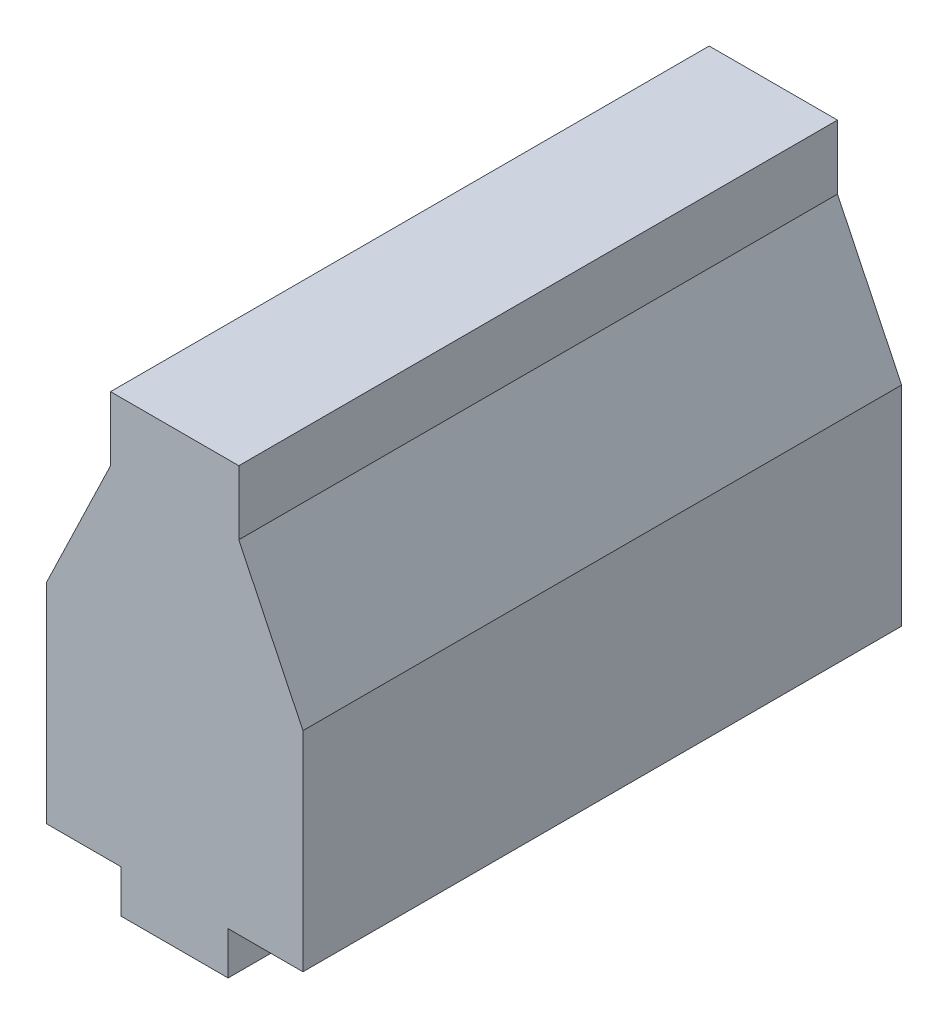
ISO-10303-21;
HEADER;
FILE_DESCRIPTION(('STEP AP214'),'2;1');
FILE_NAME('part.step','',(''),(''),'','','');
FILE_SCHEMA(('AUTOMOTIVE_DESIGN { 1 0 10303 214 1 1 1 1 }'));
ENDSEC;
DATA;
#1=APPLICATION_CONTEXT('core data for automotive mechanical design processes');
#2=APPLICATION_PROTOCOL_DEFINITION('international standard','automotive_design',2000,#1);
#3=PRODUCT_CONTEXT('',#1,'mechanical');
#4=PRODUCT('Part','Part','',(#3));
#5=PRODUCT_RELATED_PRODUCT_CATEGORY('part','',(#4));
#6=PRODUCT_DEFINITION_FORMATION('','',#4);
#7=PRODUCT_DEFINITION_CONTEXT('part definition',#1,'design');
#8=PRODUCT_DEFINITION('design','',#6,#7);
#9=PRODUCT_DEFINITION_SHAPE('','',#8);
#10=(LENGTH_UNIT() NAMED_UNIT(*) SI_UNIT(.MILLI.,.METRE.));
#11=(NAMED_UNIT(*) PLANE_ANGLE_UNIT() SI_UNIT($,.RADIAN.));
#12=(NAMED_UNIT(*) SI_UNIT($,.STERADIAN.) SOLID_ANGLE_UNIT());
#13=UNCERTAINTY_MEASURE_WITH_UNIT(LENGTH_MEASURE(1.E-05),#10,'distance_accuracy_value','');
#14=(GEOMETRIC_REPRESENTATION_CONTEXT(3) GLOBAL_UNCERTAINTY_ASSIGNED_CONTEXT((#13)) GLOBAL_UNIT_ASSIGNED_CONTEXT((#10,
#11,#12)) REPRESENTATION_CONTEXT('',''));
#15=CARTESIAN_POINT('',(0.,0.,0.));
#16=DIRECTION('',(0.,0.,1.));
#17=DIRECTION('',(1.,0.,0.));
#18=AXIS2_PLACEMENT_3D('',#15,#16,#17);
#19=CARTESIAN_POINT('',(-3.,5.2695652173913,28.));
#20=DIRECTION('',(1.,0.,0.));
#21=DIRECTION('',(0.,0.,-1.));
#22=AXIS2_PLACEMENT_3D('',#19,#20,#21);
#23=PLANE('',#22);
#24=DIRECTION('',(0.,-1.,0.));
#25=VECTOR('',#24,1.);
#26=CARTESIAN_POINT('',(-3.,5.2695652173913,0.));
#27=LINE('',#26,#25);
#28=CARTESIAN_POINT('',(-3.,8.2695652173913,0.));
#29=VERTEX_POINT('',#28);
#30=CARTESIAN_POINT('',(-3.,5.2695652173913,0.));
#31=VERTEX_POINT('',#30);
#32=EDGE_CURVE('E154',#29,#31,#27,.T.);
#33=ORIENTED_EDGE('',*,*,#32,.T.);
#34=DIRECTION('',(0.,0.,-1.));
#35=VECTOR('',#34,1.);
#36=CARTESIAN_POINT('',(-3.,5.2695652173913,28.));
#37=LINE('',#36,#35);
#38=CARTESIAN_POINT('',(-3.,5.2695652173913,28.));
#39=VERTEX_POINT('',#38);
#40=EDGE_CURVE('E11',#39,#31,#37,.T.);
#41=ORIENTED_EDGE('',*,*,#40,.F.);
#42=DIRECTION('',(0.,-1.,0.));
#43=VECTOR('',#42,1.);
#44=CARTESIAN_POINT('',(-3.,5.2695652173913,28.));
#45=LINE('',#44,#43);
#46=CARTESIAN_POINT('',(-3.,8.2695652173913,28.));
#47=VERTEX_POINT('',#46);
#48=EDGE_CURVE('E176',#47,#39,#45,.T.);
#49=ORIENTED_EDGE('',*,*,#48,.F.);
#50=DIRECTION('',(0.,0.,-1.));
#51=VECTOR('',#50,1.);
#52=CARTESIAN_POINT('',(-3.,8.2695652173913,28.));
#53=LINE('',#52,#51);
#54=EDGE_CURVE('E150',#47,#29,#53,.T.);
#55=ORIENTED_EDGE('',*,*,#54,.T.);
#56=EDGE_LOOP('',(#33,#41,#49,#55));
#57=FACE_BOUND('',#56,.T.);
#58=ADVANCED_FACE('F34',(#57),#23,.F.);
#59=CARTESIAN_POINT('',(-3.,5.2695652173913,28.));
#60=DIRECTION('',(0.901110804696941,-0.433588880921122,0.));
#61=DIRECTION('',(0.433588880921123,0.901110804696941,0.));
#62=AXIS2_PLACEMENT_3D('',#59,#60,#61);
#63=PLANE('',#62);
#64=DIRECTION('',(-0.433588880921123,-0.901110804696941,0.));
#65=VECTOR('',#64,1.);
#66=CARTESIAN_POINT('',(-3.,5.2695652173913,0.));
#67=LINE('',#66,#65);
#68=CARTESIAN_POINT('',(-6.,-0.965217391304347,0.));
#69=VERTEX_POINT('',#68);
#70=EDGE_CURVE('E157',#31,#69,#67,.T.);
#71=ORIENTED_EDGE('',*,*,#70,.T.);
#72=DIRECTION('',(0.,0.,-1.));
#73=VECTOR('',#72,1.);
#74=CARTESIAN_POINT('',(-6.,-0.965217391304347,28.));
#75=LINE('',#74,#73);
#76=CARTESIAN_POINT('',(-6.,-0.965217391304347,28.));
#77=VERTEX_POINT('',#76);
#78=EDGE_CURVE('E42',#77,#69,#75,.T.);
#79=ORIENTED_EDGE('',*,*,#78,.F.);
#80=DIRECTION('',(-0.433588880921123,-0.901110804696941,0.));
#81=VECTOR('',#80,1.);
#82=CARTESIAN_POINT('',(-3.,5.2695652173913,28.));
#83=LINE('',#82,#81);
#84=EDGE_CURVE('E105',#39,#77,#83,.T.);
#85=ORIENTED_EDGE('',*,*,#84,.F.);
#86=ORIENTED_EDGE('',*,*,#40,.T.);
#87=EDGE_LOOP('',(#71,#79,#85,#86));
#88=FACE_BOUND('',#87,.T.);
#89=ADVANCED_FACE('F254',(#88),#63,.F.);
#90=CARTESIAN_POINT('',(-6.,-0.965217391304347,28.));
#91=DIRECTION('',(1.,0.,0.));
#92=DIRECTION('',(0.,1.,0.));
#93=AXIS2_PLACEMENT_3D('',#90,#91,#92);
#94=PLANE('',#93);
#95=DIRECTION('',(0.,-1.,0.));
#96=VECTOR('',#95,1.);
#97=CARTESIAN_POINT('',(-6.,-0.965217391304347,0.));
#98=LINE('',#97,#96);
#99=CARTESIAN_POINT('',(-6.,-10.7304347826087,0.));
#100=VERTEX_POINT('',#99);
#101=EDGE_CURVE('E159',#69,#100,#98,.T.);
#102=ORIENTED_EDGE('',*,*,#101,.T.);
#103=DIRECTION('',(0.,0.,-1.));
#104=VECTOR('',#103,1.);
#105=CARTESIAN_POINT('',(-6.,-10.7304347826087,28.));
#106=LINE('',#105,#104);
#107=CARTESIAN_POINT('',(-6.,-10.7304347826087,28.));
#108=VERTEX_POINT('',#107);
#109=EDGE_CURVE('E195',#108,#100,#106,.T.);
#110=ORIENTED_EDGE('',*,*,#109,.F.);
#111=DIRECTION('',(0.,-1.,0.));
#112=VECTOR('',#111,1.);
#113=CARTESIAN_POINT('',(-6.,-0.965217391304347,28.));
#114=LINE('',#113,#112);
#115=EDGE_CURVE('E203',#77,#108,#114,.T.);
#116=ORIENTED_EDGE('',*,*,#115,.F.);
#117=ORIENTED_EDGE('',*,*,#78,.T.);
#118=EDGE_LOOP('',(#102,#110,#116,#117));
#119=FACE_BOUND('',#118,.T.);
#120=ADVANCED_FACE('F201',(#119),#94,.F.);
#121=CARTESIAN_POINT('',(-6.,-10.7304347826087,28.));
#122=DIRECTION('',(0.,1.,0.));
#123=DIRECTION('',(0.,0.,1.));
#124=AXIS2_PLACEMENT_3D('',#121,#122,#123);
#125=PLANE('',#124);
#126=DIRECTION('',(1.,0.,0.));
#127=VECTOR('',#126,1.);
#128=CARTESIAN_POINT('',(-6.,-10.7304347826087,0.));
#129=LINE('',#128,#127);
#130=CARTESIAN_POINT('',(-2.5,-10.7304347826087,0.));
#131=VERTEX_POINT('',#130);
#132=EDGE_CURVE('E161',#100,#131,#129,.T.);
#133=ORIENTED_EDGE('',*,*,#132,.T.);
#134=DIRECTION('',(0.,0.,-1.));
#135=VECTOR('',#134,1.);
#136=CARTESIAN_POINT('',(-2.5,-10.7304347826087,28.));
#137=LINE('',#136,#135);
#138=CARTESIAN_POINT('',(-2.5,-10.7304347826087,28.));
#139=VERTEX_POINT('',#138);
#140=EDGE_CURVE('E192',#139,#131,#137,.T.);
#141=ORIENTED_EDGE('',*,*,#140,.F.);
#142=DIRECTION('',(1.,0.,0.));
#143=VECTOR('',#142,1.);
#144=CARTESIAN_POINT('',(-6.,-10.7304347826087,28.));
#145=LINE('',#144,#143);
#146=EDGE_CURVE('E221',#108,#139,#145,.T.);
#147=ORIENTED_EDGE('',*,*,#146,.F.);
#148=ORIENTED_EDGE('',*,*,#109,.T.);
#149=EDGE_LOOP('',(#133,#141,#147,#148));
#150=FACE_BOUND('',#149,.T.);
#151=ADVANCED_FACE('F212',(#150),#125,.F.);
#152=CARTESIAN_POINT('',(-2.5,-10.7304347826087,28.));
#153=DIRECTION('',(1.,0.,0.));
#154=DIRECTION('',(0.,1.,0.));
#155=AXIS2_PLACEMENT_3D('',#152,#153,#154);
#156=PLANE('',#155);
#157=DIRECTION('',(0.,-1.,0.));
#158=VECTOR('',#157,1.);
#159=CARTESIAN_POINT('',(-2.5,-10.7304347826087,0.));
#160=LINE('',#159,#158);
#161=CARTESIAN_POINT('',(-2.5,-12.7304347826087,0.));
#162=VERTEX_POINT('',#161);
#163=EDGE_CURVE('E163',#131,#162,#160,.T.);
#164=ORIENTED_EDGE('',*,*,#163,.T.);
#165=DIRECTION('',(0.,0.,-1.));
#166=VECTOR('',#165,1.);
#167=CARTESIAN_POINT('',(-2.5,-12.7304347826087,28.));
#168=LINE('',#167,#166);
#169=CARTESIAN_POINT('',(-2.5,-12.7304347826087,28.));
#170=VERTEX_POINT('',#169);
#171=EDGE_CURVE('E189',#170,#162,#168,.T.);
#172=ORIENTED_EDGE('',*,*,#171,.F.);
#173=DIRECTION('',(0.,-1.,0.));
#174=VECTOR('',#173,1.);
#175=CARTESIAN_POINT('',(-2.5,-10.7304347826087,28.));
#176=LINE('',#175,#174);
#177=EDGE_CURVE('E218',#139,#170,#176,.T.);
#178=ORIENTED_EDGE('',*,*,#177,.F.);
#179=ORIENTED_EDGE('',*,*,#140,.T.);
#180=EDGE_LOOP('',(#164,#172,#178,#179));
#181=FACE_BOUND('',#180,.T.);
#182=ADVANCED_FACE('F216',(#181),#156,.F.);
#183=CARTESIAN_POINT('',(-2.5,-12.7304347826087,28.));
#184=DIRECTION('',(0.,1.,0.));
#185=DIRECTION('',(0.,0.,1.));
#186=AXIS2_PLACEMENT_3D('',#183,#184,#185);
#187=PLANE('',#186);
#188=DIRECTION('',(1.,0.,0.));
#189=VECTOR('',#188,1.);
#190=CARTESIAN_POINT('',(-2.5,-12.7304347826087,0.));
#191=LINE('',#190,#189);
#192=CARTESIAN_POINT('',(2.5,-12.7304347826087,0.));
#193=VERTEX_POINT('',#192);
#194=EDGE_CURVE('E165',#162,#193,#191,.T.);
#195=ORIENTED_EDGE('',*,*,#194,.T.);
#196=DIRECTION('',(0.,0.,-1.));
#197=VECTOR('',#196,1.);
#198=CARTESIAN_POINT('',(2.5,-12.7304347826087,28.));
#199=LINE('',#198,#197);
#200=CARTESIAN_POINT('',(2.5,-12.7304347826087,28.));
#201=VERTEX_POINT('',#200);
#202=EDGE_CURVE('E186',#201,#193,#199,.T.);
#203=ORIENTED_EDGE('',*,*,#202,.F.);
#204=DIRECTION('',(1.,0.,0.));
#205=VECTOR('',#204,1.);
#206=CARTESIAN_POINT('',(-2.5,-12.7304347826087,28.));
#207=LINE('',#206,#205);
#208=EDGE_CURVE('E220',#170,#201,#207,.T.);
#209=ORIENTED_EDGE('',*,*,#208,.F.);
#210=ORIENTED_EDGE('',*,*,#171,.T.);
#211=EDGE_LOOP('',(#195,#203,#209,#210));
#212=FACE_BOUND('',#211,.T.);
#213=ADVANCED_FACE('F267',(#212),#187,.F.);
#214=CARTESIAN_POINT('',(2.5,-12.7304347826087,28.));
#215=DIRECTION('',(-1.,0.,0.));
#216=DIRECTION('',(0.,-1.,0.));
#217=AXIS2_PLACEMENT_3D('',#214,#215,#216);
#218=PLANE('',#217);
#219=DIRECTION('',(0.,1.,0.));
#220=VECTOR('',#219,1.);
#221=CARTESIAN_POINT('',(2.5,-12.7304347826087,0.));
#222=LINE('',#221,#220);
#223=CARTESIAN_POINT('',(2.5,-10.7304347826087,0.));
#224=VERTEX_POINT('',#223);
#225=EDGE_CURVE('E167',#193,#224,#222,.T.);
#226=ORIENTED_EDGE('',*,*,#225,.T.);
#227=DIRECTION('',(0.,0.,-1.));
#228=VECTOR('',#227,1.);
#229=CARTESIAN_POINT('',(2.5,-10.7304347826087,28.));
#230=LINE('',#229,#228);
#231=CARTESIAN_POINT('',(2.5,-10.7304347826087,28.));
#232=VERTEX_POINT('',#231);
#233=EDGE_CURVE('E183',#232,#224,#230,.T.);
#234=ORIENTED_EDGE('',*,*,#233,.F.);
#235=DIRECTION('',(0.,1.,0.));
#236=VECTOR('',#235,1.);
#237=CARTESIAN_POINT('',(2.5,-12.7304347826087,28.));
#238=LINE('',#237,#236);
#239=EDGE_CURVE('E223',#201,#232,#238,.T.);
#240=ORIENTED_EDGE('',*,*,#239,.F.);
#241=ORIENTED_EDGE('',*,*,#202,.T.);
#242=EDGE_LOOP('',(#226,#234,#240,#241));
#243=FACE_BOUND('',#242,.T.);
#244=ADVANCED_FACE('F270',(#243),#218,.F.);
#245=CARTESIAN_POINT('',(2.5,-10.7304347826087,28.));
#246=DIRECTION('',(0.,1.,0.));
#247=DIRECTION('',(0.,0.,1.));
#248=AXIS2_PLACEMENT_3D('',#245,#246,#247);
#249=PLANE('',#248);
#250=DIRECTION('',(1.,0.,0.));
#251=VECTOR('',#250,1.);
#252=CARTESIAN_POINT('',(2.5,-10.7304347826087,0.));
#253=LINE('',#252,#251);
#254=CARTESIAN_POINT('',(6.,-10.7304347826087,0.));
#255=VERTEX_POINT('',#254);
#256=EDGE_CURVE('E169',#224,#255,#253,.T.);
#257=ORIENTED_EDGE('',*,*,#256,.T.);
#258=DIRECTION('',(0.,0.,-1.));
#259=VECTOR('',#258,1.);
#260=CARTESIAN_POINT('',(6.,-10.7304347826087,28.));
#261=LINE('',#260,#259);
#262=CARTESIAN_POINT('',(6.,-10.7304347826087,28.));
#263=VERTEX_POINT('',#262);
#264=EDGE_CURVE('E180',#263,#255,#261,.T.);
#265=ORIENTED_EDGE('',*,*,#264,.F.);
#266=DIRECTION('',(1.,0.,0.));
#267=VECTOR('',#266,1.);
#268=CARTESIAN_POINT('',(2.5,-10.7304347826087,28.));
#269=LINE('',#268,#267);
#270=EDGE_CURVE('E229',#232,#263,#269,.T.);
#271=ORIENTED_EDGE('',*,*,#270,.F.);
#272=ORIENTED_EDGE('',*,*,#233,.T.);
#273=EDGE_LOOP('',(#257,#265,#271,#272));
#274=FACE_BOUND('',#273,.T.);
#275=ADVANCED_FACE('F235',(#274),#249,.F.);
#276=CARTESIAN_POINT('',(6.,-10.7304347826087,28.));
#277=DIRECTION('',(-1.,0.,0.));
#278=DIRECTION('',(0.,0.,1.));
#279=AXIS2_PLACEMENT_3D('',#276,#277,#278);
#280=PLANE('',#279);
#281=DIRECTION('',(0.,1.,0.));
#282=VECTOR('',#281,1.);
#283=CARTESIAN_POINT('',(6.,-10.7304347826087,0.));
#284=LINE('',#283,#282);
#285=CARTESIAN_POINT('',(6.,-0.960434782608701,0.));
#286=VERTEX_POINT('',#285);
#287=EDGE_CURVE('E171',#255,#286,#284,.T.);
#288=ORIENTED_EDGE('',*,*,#287,.T.);
#289=DIRECTION('',(0.,0.,-1.));
#290=VECTOR('',#289,1.);
#291=CARTESIAN_POINT('',(6.,-0.960434782608701,28.));
#292=LINE('',#291,#290);
#293=CARTESIAN_POINT('',(6.,-0.960434782608701,28.));
#294=VERTEX_POINT('',#293);
#295=EDGE_CURVE('E145',#294,#286,#292,.T.);
#296=ORIENTED_EDGE('',*,*,#295,.F.);
#297=DIRECTION('',(0.,1.,0.));
#298=VECTOR('',#297,1.);
#299=CARTESIAN_POINT('',(6.,-10.7304347826087,28.));
#300=LINE('',#299,#298);
#301=EDGE_CURVE('E136',#263,#294,#300,.T.);
#302=ORIENTED_EDGE('',*,*,#301,.F.);
#303=ORIENTED_EDGE('',*,*,#264,.T.);
#304=EDGE_LOOP('',(#288,#296,#302,#303));
#305=FACE_BOUND('',#304,.T.);
#306=ADVANCED_FACE('F239',(#305),#280,.F.);
#307=CARTESIAN_POINT('',(6.,-0.960434782608701,28.));
#308=DIRECTION('',(-0.900980732673074,-0.433859100805654,0.));
#309=DIRECTION('',(0.433859100805654,-0.900980732673074,0.));
#310=AXIS2_PLACEMENT_3D('',#307,#308,#309);
#311=PLANE('',#310);
#312=DIRECTION('',(-0.433859100805654,0.900980732673074,0.));
#313=VECTOR('',#312,1.);
#314=CARTESIAN_POINT('',(6.,-0.960434782608701,0.));
#315=LINE('',#314,#313);
#316=CARTESIAN_POINT('',(3.,5.2695652173913,0.));
#317=VERTEX_POINT('',#316);
#318=EDGE_CURVE('E144',#286,#317,#315,.T.);
#319=ORIENTED_EDGE('',*,*,#318,.T.);
#320=DIRECTION('',(0.,0.,-1.));
#321=VECTOR('',#320,1.);
#322=CARTESIAN_POINT('',(3.,5.2695652173913,28.));
#323=LINE('',#322,#321);
#324=CARTESIAN_POINT('',(3.,5.2695652173913,28.));
#325=VERTEX_POINT('',#324);
#326=EDGE_CURVE('E141',#325,#317,#323,.T.);
#327=ORIENTED_EDGE('',*,*,#326,.F.);
#328=DIRECTION('',(-0.433859100805654,0.900980732673074,0.));
#329=VECTOR('',#328,1.);
#330=CARTESIAN_POINT('',(6.,-0.960434782608701,28.));
#331=LINE('',#330,#329);
#332=EDGE_CURVE('E130',#294,#325,#331,.T.);
#333=ORIENTED_EDGE('',*,*,#332,.F.);
#334=ORIENTED_EDGE('',*,*,#295,.T.);
#335=EDGE_LOOP('',(#319,#327,#333,#334));
#336=FACE_BOUND('',#335,.T.);
#337=ADVANCED_FACE('F142',(#336),#311,.F.);
#338=CARTESIAN_POINT('',(3.,8.2695652173913,28.));
#339=DIRECTION('',(-1.,0.,0.));
#340=DIRECTION('',(0.,-1.,0.));
#341=AXIS2_PLACEMENT_3D('',#338,#339,#340);
#342=PLANE('',#341);
#343=DIRECTION('',(0.,1.,0.));
#344=VECTOR('',#343,1.);
#345=CARTESIAN_POINT('',(3.,8.2695652173913,0.));
#346=LINE('',#345,#344);
#347=CARTESIAN_POINT('',(3.,8.2695652173913,0.));
#348=VERTEX_POINT('',#347);
#349=EDGE_CURVE('E91',#317,#348,#346,.T.);
#350=ORIENTED_EDGE('',*,*,#349,.T.);
#351=DIRECTION('',(0.,0.,-1.));
#352=VECTOR('',#351,1.);
#353=CARTESIAN_POINT('',(3.,8.2695652173913,28.));
#354=LINE('',#353,#352);
#355=CARTESIAN_POINT('',(3.,8.2695652173913,28.));
#356=VERTEX_POINT('',#355);
#357=EDGE_CURVE('E146',#356,#348,#354,.T.);
#358=ORIENTED_EDGE('',*,*,#357,.F.);
#359=DIRECTION('',(0.,1.,0.));
#360=VECTOR('',#359,1.);
#361=CARTESIAN_POINT('',(3.,8.2695652173913,28.));
#362=LINE('',#361,#360);
#363=EDGE_CURVE('E134',#325,#356,#362,.T.);
#364=ORIENTED_EDGE('',*,*,#363,.F.);
#365=ORIENTED_EDGE('',*,*,#326,.T.);
#366=EDGE_LOOP('',(#350,#358,#364,#365));
#367=FACE_BOUND('',#366,.T.);
#368=ADVANCED_FACE('F148',(#367),#342,.F.);
#369=CARTESIAN_POINT('',(-3.,8.2695652173913,28.));
#370=DIRECTION('',(0.,-1.,0.));
#371=DIRECTION('',(0.,0.,-1.));
#372=AXIS2_PLACEMENT_3D('',#369,#370,#371);
#373=PLANE('',#372);
#374=DIRECTION('',(-1.,0.,0.));
#375=VECTOR('',#374,1.);
#376=CARTESIAN_POINT('',(-3.,8.2695652173913,0.));
#377=LINE('',#376,#375);
#378=EDGE_CURVE('E97',#348,#29,#377,.T.);
#379=ORIENTED_EDGE('',*,*,#378,.T.);
#380=ORIENTED_EDGE('',*,*,#54,.F.);
#381=DIRECTION('',(-1.,0.,0.));
#382=VECTOR('',#381,1.);
#383=CARTESIAN_POINT('',(-3.,8.2695652173913,28.));
#384=LINE('',#383,#382);
#385=EDGE_CURVE('E50',#356,#47,#384,.T.);
#386=ORIENTED_EDGE('',*,*,#385,.F.);
#387=ORIENTED_EDGE('',*,*,#357,.T.);
#388=EDGE_LOOP('',(#379,#380,#386,#387));
#389=FACE_BOUND('',#388,.T.);
#390=ADVANCED_FACE('F243',(#389),#373,.F.);
#391=CARTESIAN_POINT('',(0.,0.,28.));
#392=DIRECTION('',(0.,0.,-1.));
#393=DIRECTION('',(-1.,0.,0.));
#394=AXIS2_PLACEMENT_3D('',#391,#392,#393);
#395=PLANE('',#394);
#396=ORIENTED_EDGE('',*,*,#48,.T.);
#397=ORIENTED_EDGE('',*,*,#84,.T.);
#398=ORIENTED_EDGE('',*,*,#115,.T.);
#399=ORIENTED_EDGE('',*,*,#146,.T.);
#400=ORIENTED_EDGE('',*,*,#177,.T.);
#401=ORIENTED_EDGE('',*,*,#208,.T.);
#402=ORIENTED_EDGE('',*,*,#239,.T.);
#403=ORIENTED_EDGE('',*,*,#270,.T.);
#404=ORIENTED_EDGE('',*,*,#301,.T.);
#405=ORIENTED_EDGE('',*,*,#332,.T.);
#406=ORIENTED_EDGE('',*,*,#363,.T.);
#407=ORIENTED_EDGE('',*,*,#385,.T.);
#408=EDGE_LOOP('',(#396,#397,#398,#399,#400,#401,#402,#403,#404,#405,#406,#407));
#409=FACE_BOUND('',#408,.T.);
#410=ADVANCED_FACE('F132',(#409),#395,.F.);
#411=CARTESIAN_POINT('',(0.,0.,0.));
#412=DIRECTION('',(0.,0.,-1.));
#413=DIRECTION('',(-1.,0.,0.));
#414=AXIS2_PLACEMENT_3D('',#411,#412,#413);
#415=PLANE('',#414);
#416=ORIENTED_EDGE('',*,*,#32,.F.);
#417=ORIENTED_EDGE('',*,*,#378,.F.);
#418=ORIENTED_EDGE('',*,*,#349,.F.);
#419=ORIENTED_EDGE('',*,*,#318,.F.);
#420=ORIENTED_EDGE('',*,*,#287,.F.);
#421=ORIENTED_EDGE('',*,*,#256,.F.);
#422=ORIENTED_EDGE('',*,*,#225,.F.);
#423=ORIENTED_EDGE('',*,*,#194,.F.);
#424=ORIENTED_EDGE('',*,*,#163,.F.);
#425=ORIENTED_EDGE('',*,*,#132,.F.);
#426=ORIENTED_EDGE('',*,*,#101,.F.);
#427=ORIENTED_EDGE('',*,*,#70,.F.);
#428=EDGE_LOOP('',(#416,#417,#418,#419,#420,#421,#422,#423,#424,#425,#426,#427));
#429=FACE_BOUND('',#428,.T.);
#430=ADVANCED_FACE('F207',(#429),#415,.T.);
#431=CLOSED_SHELL('',(#58,#89,#120,#151,#182,#213,#244,#275,#306,#337,#368,#390,#410,#430));
#432=MANIFOLD_SOLID_BREP('B2',#431);
#433=ADVANCED_BREP_SHAPE_REPRESENTATION('',(#18,#432),#14);
#434=SHAPE_DEFINITION_REPRESENTATION(#9,#433);
ENDSEC;
END-ISO-10303-21;
